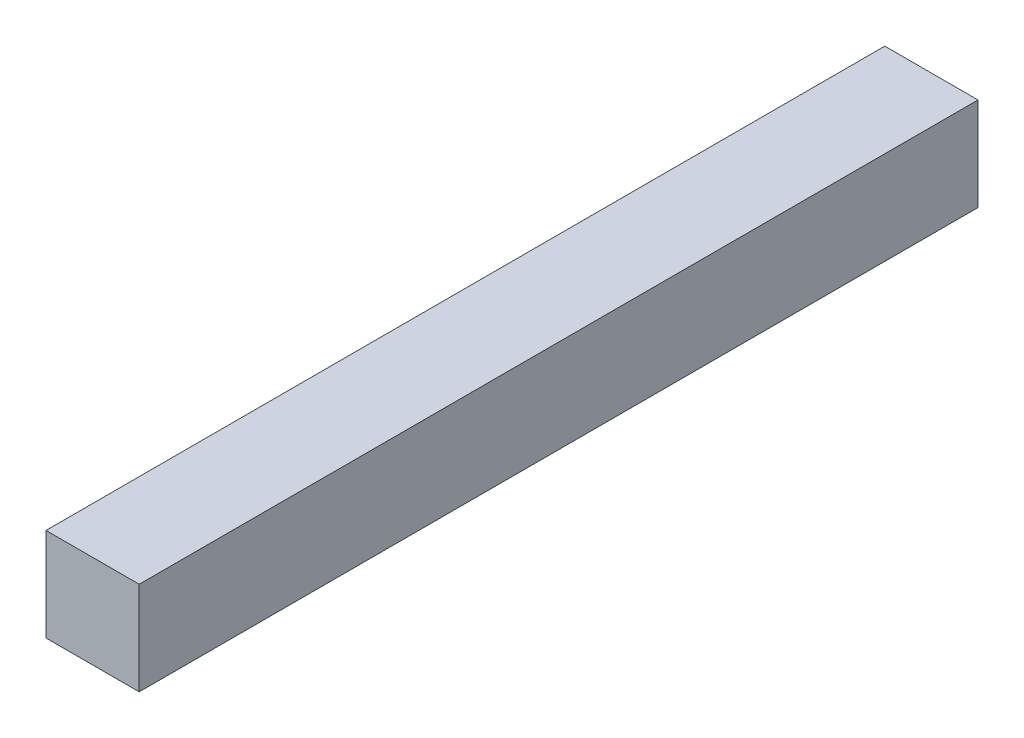
ISO-10303-21;
HEADER;
FILE_DESCRIPTION(('STEP AP214'),'2;1');
FILE_NAME('part.step','',(''),(''),'','','');
FILE_SCHEMA(('AUTOMOTIVE_DESIGN { 1 0 10303 214 1 1 1 1 }'));
ENDSEC;
DATA;
#1=APPLICATION_CONTEXT('core data for automotive mechanical design processes');
#2=APPLICATION_PROTOCOL_DEFINITION('international standard','automotive_design',2000,#1);
#3=PRODUCT_CONTEXT('',#1,'mechanical');
#4=PRODUCT('Part','Part','',(#3));
#5=PRODUCT_RELATED_PRODUCT_CATEGORY('part','',(#4));
#6=PRODUCT_DEFINITION_FORMATION('','',#4);
#7=PRODUCT_DEFINITION_CONTEXT('part definition',#1,'design');
#8=PRODUCT_DEFINITION('design','',#6,#7);
#9=PRODUCT_DEFINITION_SHAPE('','',#8);
#10=(LENGTH_UNIT() NAMED_UNIT(*) SI_UNIT(.MILLI.,.METRE.));
#11=(NAMED_UNIT(*) PLANE_ANGLE_UNIT() SI_UNIT($,.RADIAN.));
#12=(NAMED_UNIT(*) SI_UNIT($,.STERADIAN.) SOLID_ANGLE_UNIT());
#13=UNCERTAINTY_MEASURE_WITH_UNIT(LENGTH_MEASURE(1.E-05),#10,'distance_accuracy_value','');
#14=(GEOMETRIC_REPRESENTATION_CONTEXT(3) GLOBAL_UNCERTAINTY_ASSIGNED_CONTEXT((#13)) GLOBAL_UNIT_ASSIGNED_CONTEXT((#10,
#11,#12)) REPRESENTATION_CONTEXT('',''));
#15=CARTESIAN_POINT('',(0.,0.,0.));
#16=DIRECTION('',(0.,0.,1.));
#17=DIRECTION('',(1.,0.,0.));
#18=AXIS2_PLACEMENT_3D('',#15,#16,#17);
#19=CARTESIAN_POINT('',(0.,0.,22.86));
#20=DIRECTION('',(-1.,0.,0.));
#21=DIRECTION('',(0.,-1.,0.));
#22=AXIS2_PLACEMENT_3D('',#19,#20,#21);
#23=PLANE('',#22);
#24=DIRECTION('',(0.,1.,0.));
#25=VECTOR('',#24,1.);
#26=CARTESIAN_POINT('',(0.,0.,0.));
#27=LINE('',#26,#25);
#28=CARTESIAN_POINT('',(0.,0.,0.));
#29=VERTEX_POINT('',#28);
#30=CARTESIAN_POINT('',(0.,2.54,0.));
#31=VERTEX_POINT('',#30);
#32=EDGE_CURVE('E107',#29,#31,#27,.T.);
#33=ORIENTED_EDGE('',*,*,#32,.T.);
#34=DIRECTION('',(0.,0.,-1.));
#35=VECTOR('',#34,1.);
#36=CARTESIAN_POINT('',(0.,2.54,22.86));
#37=LINE('',#36,#35);
#38=CARTESIAN_POINT('',(0.,2.54,22.86));
#39=VERTEX_POINT('',#38);
#40=EDGE_CURVE('E11',#39,#31,#37,.T.);
#41=ORIENTED_EDGE('',*,*,#40,.F.);
#42=DIRECTION('',(0.,1.,0.));
#43=VECTOR('',#42,1.);
#44=CARTESIAN_POINT('',(0.,0.,22.86));
#45=LINE('',#44,#43);
#46=CARTESIAN_POINT('',(0.,0.,22.86));
#47=VERTEX_POINT('',#46);
#48=EDGE_CURVE('E91',#47,#39,#45,.T.);
#49=ORIENTED_EDGE('',*,*,#48,.F.);
#50=DIRECTION('',(0.,0.,-1.));
#51=VECTOR('',#50,1.);
#52=CARTESIAN_POINT('',(0.,0.,22.86));
#53=LINE('',#52,#51);
#54=EDGE_CURVE('E103',#47,#29,#53,.T.);
#55=ORIENTED_EDGE('',*,*,#54,.T.);
#56=EDGE_LOOP('',(#33,#41,#49,#55));
#57=FACE_BOUND('',#56,.T.);
#58=ADVANCED_FACE('F39',(#57),#23,.F.);
#59=CARTESIAN_POINT('',(0.,2.54,22.86));
#60=DIRECTION('',(0.,-1.,0.));
#61=DIRECTION('',(1.,0.,0.));
#62=AXIS2_PLACEMENT_3D('',#59,#60,#61);
#63=PLANE('',#62);
#64=DIRECTION('',(-1.,0.,0.));
#65=VECTOR('',#64,1.);
#66=CARTESIAN_POINT('',(0.,2.54,0.));
#67=LINE('',#66,#65);
#68=CARTESIAN_POINT('',(-2.54,2.54,0.));
#69=VERTEX_POINT('',#68);
#70=EDGE_CURVE('E96',#31,#69,#67,.T.);
#71=ORIENTED_EDGE('',*,*,#70,.T.);
#72=DIRECTION('',(0.,0.,-1.));
#73=VECTOR('',#72,1.);
#74=CARTESIAN_POINT('',(-2.54,2.54,22.86));
#75=LINE('',#74,#73);
#76=CARTESIAN_POINT('',(-2.54,2.54,22.86));
#77=VERTEX_POINT('',#76);
#78=EDGE_CURVE('E48',#77,#69,#75,.T.);
#79=ORIENTED_EDGE('',*,*,#78,.F.);
#80=DIRECTION('',(-1.,0.,0.));
#81=VECTOR('',#80,1.);
#82=CARTESIAN_POINT('',(0.,2.54,22.86));
#83=LINE('',#82,#81);
#84=EDGE_CURVE('E86',#39,#77,#83,.T.);
#85=ORIENTED_EDGE('',*,*,#84,.F.);
#86=ORIENTED_EDGE('',*,*,#40,.T.);
#87=EDGE_LOOP('',(#71,#79,#85,#86));
#88=FACE_BOUND('',#87,.T.);
#89=ADVANCED_FACE('F95',(#88),#63,.F.);
#90=CARTESIAN_POINT('',(-2.54,0.,22.86));
#91=DIRECTION('',(1.,0.,0.));
#92=DIRECTION('',(0.,0.,-1.));
#93=AXIS2_PLACEMENT_3D('',#90,#91,#92);
#94=PLANE('',#93);
#95=DIRECTION('',(0.,-1.,0.));
#96=VECTOR('',#95,1.);
#97=CARTESIAN_POINT('',(-2.54,0.,0.));
#98=LINE('',#97,#96);
#99=CARTESIAN_POINT('',(-2.54,0.,0.));
#100=VERTEX_POINT('',#99);
#101=EDGE_CURVE('E73',#69,#100,#98,.T.);
#102=ORIENTED_EDGE('',*,*,#101,.T.);
#103=DIRECTION('',(0.,0.,-1.));
#104=VECTOR('',#103,1.);
#105=CARTESIAN_POINT('',(-2.54,0.,22.86));
#106=LINE('',#105,#104);
#107=CARTESIAN_POINT('',(-2.54,0.,22.86));
#108=VERTEX_POINT('',#107);
#109=EDGE_CURVE('E98',#108,#100,#106,.T.);
#110=ORIENTED_EDGE('',*,*,#109,.F.);
#111=DIRECTION('',(0.,-1.,0.));
#112=VECTOR('',#111,1.);
#113=CARTESIAN_POINT('',(-2.54,0.,22.86));
#114=LINE('',#113,#112);
#115=EDGE_CURVE('E89',#77,#108,#114,.T.);
#116=ORIENTED_EDGE('',*,*,#115,.F.);
#117=ORIENTED_EDGE('',*,*,#78,.T.);
#118=EDGE_LOOP('',(#102,#110,#116,#117));
#119=FACE_BOUND('',#118,.T.);
#120=ADVANCED_FACE('F99',(#119),#94,.F.);
#121=CARTESIAN_POINT('',(0.,0.,22.86));
#122=DIRECTION('',(0.,1.,0.));
#123=DIRECTION('',(0.,0.,1.));
#124=AXIS2_PLACEMENT_3D('',#121,#122,#123);
#125=PLANE('',#124);
#126=DIRECTION('',(1.,0.,0.));
#127=VECTOR('',#126,1.);
#128=CARTESIAN_POINT('',(0.,0.,0.));
#129=LINE('',#128,#127);
#130=EDGE_CURVE('E79',#100,#29,#129,.T.);
#131=ORIENTED_EDGE('',*,*,#130,.T.);
#132=ORIENTED_EDGE('',*,*,#54,.F.);
#133=DIRECTION('',(1.,0.,0.));
#134=VECTOR('',#133,1.);
#135=CARTESIAN_POINT('',(0.,0.,22.86));
#136=LINE('',#135,#134);
#137=EDGE_CURVE('E56',#108,#47,#136,.T.);
#138=ORIENTED_EDGE('',*,*,#137,.F.);
#139=ORIENTED_EDGE('',*,*,#109,.T.);
#140=EDGE_LOOP('',(#131,#132,#138,#139));
#141=FACE_BOUND('',#140,.T.);
#142=ADVANCED_FACE('F120',(#141),#125,.F.);
#143=CARTESIAN_POINT('',(0.,0.,22.86));
#144=DIRECTION('',(0.,0.,1.));
#145=DIRECTION('',(1.,0.,0.));
#146=AXIS2_PLACEMENT_3D('',#143,#144,#145);
#147=PLANE('',#146);
#148=ORIENTED_EDGE('',*,*,#48,.T.);
#149=ORIENTED_EDGE('',*,*,#84,.T.);
#150=ORIENTED_EDGE('',*,*,#115,.T.);
#151=ORIENTED_EDGE('',*,*,#137,.T.);
#152=EDGE_LOOP('',(#148,#149,#150,#151));
#153=FACE_BOUND('',#152,.T.);
#154=ADVANCED_FACE('F87',(#153),#147,.T.);
#155=CARTESIAN_POINT('',(0.,0.,0.));
#156=DIRECTION('',(0.,0.,1.));
#157=DIRECTION('',(1.,0.,0.));
#158=AXIS2_PLACEMENT_3D('',#155,#156,#157);
#159=PLANE('',#158);
#160=ORIENTED_EDGE('',*,*,#32,.F.);
#161=ORIENTED_EDGE('',*,*,#130,.F.);
#162=ORIENTED_EDGE('',*,*,#101,.F.);
#163=ORIENTED_EDGE('',*,*,#70,.F.);
#164=EDGE_LOOP('',(#160,#161,#162,#163));
#165=FACE_BOUND('',#164,.T.);
#166=ADVANCED_FACE('F123',(#165),#159,.F.);
#167=CLOSED_SHELL('',(#58,#89,#120,#142,#154,#166));
#168=MANIFOLD_SOLID_BREP('B2',#167);
#169=ADVANCED_BREP_SHAPE_REPRESENTATION('',(#18,#168),#14);
#170=SHAPE_DEFINITION_REPRESENTATION(#9,#169);
ENDSEC;
END-ISO-10303-21;
